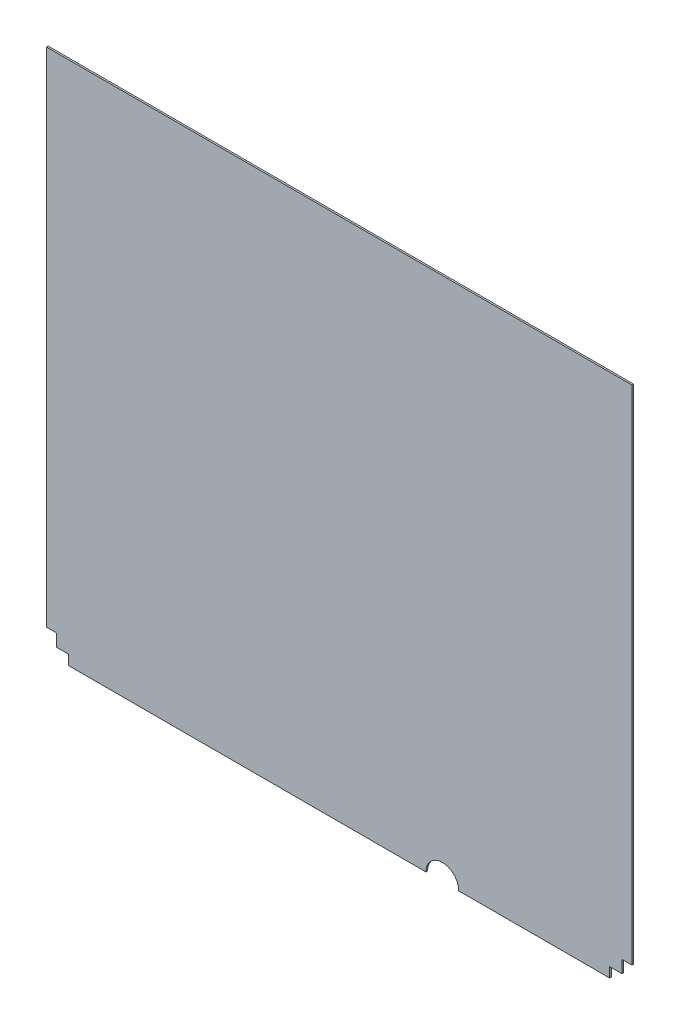
ISO-10303-21;
HEADER;
FILE_DESCRIPTION(('STEP AP214'),'2;1');
FILE_NAME('part.step','',(''),(''),'','','');
FILE_SCHEMA(('AUTOMOTIVE_DESIGN { 1 0 10303 214 1 1 1 1 }'));
ENDSEC;
DATA;
#1=APPLICATION_CONTEXT('core data for automotive mechanical design processes');
#2=APPLICATION_PROTOCOL_DEFINITION('international standard','automotive_design',2000,#1);
#3=PRODUCT_CONTEXT('',#1,'mechanical');
#4=PRODUCT('Part','Part','',(#3));
#5=PRODUCT_RELATED_PRODUCT_CATEGORY('part','',(#4));
#6=PRODUCT_DEFINITION_FORMATION('','',#4);
#7=PRODUCT_DEFINITION_CONTEXT('part definition',#1,'design');
#8=PRODUCT_DEFINITION('design','',#6,#7);
#9=PRODUCT_DEFINITION_SHAPE('','',#8);
#10=(LENGTH_UNIT() NAMED_UNIT(*) SI_UNIT(.MILLI.,.METRE.));
#11=(NAMED_UNIT(*) PLANE_ANGLE_UNIT() SI_UNIT($,.RADIAN.));
#12=(NAMED_UNIT(*) SI_UNIT($,.STERADIAN.) SOLID_ANGLE_UNIT());
#13=UNCERTAINTY_MEASURE_WITH_UNIT(LENGTH_MEASURE(1.E-05),#10,'distance_accuracy_value','');
#14=(GEOMETRIC_REPRESENTATION_CONTEXT(3) GLOBAL_UNCERTAINTY_ASSIGNED_CONTEXT((#13)) GLOBAL_UNIT_ASSIGNED_CONTEXT((#10,
#11,#12)) REPRESENTATION_CONTEXT('',''));
#15=CARTESIAN_POINT('',(0.,0.,0.));
#16=DIRECTION('',(0.,0.,1.));
#17=DIRECTION('',(1.,0.,0.));
#18=AXIS2_PLACEMENT_3D('',#15,#16,#17);
#19=CARTESIAN_POINT('',(613.304273944376,0.,2.54));
#20=DIRECTION('',(0.,0.,-1.));
#21=DIRECTION('',(-1.,0.,0.));
#22=AXIS2_PLACEMENT_3D('',#19,#20,#21);
#23=CYLINDRICAL_SURFACE('',#22,25.4);
#24=CARTESIAN_POINT('',(613.304273944376,0.,0.));
#25=DIRECTION('',(0.,0.,1.));
#26=DIRECTION('',(1.,0.,0.));
#27=AXIS2_PLACEMENT_3D('',#24,#25,#26);
#28=CIRCLE('',#27,25.4);
#29=CARTESIAN_POINT('',(638.704273944376,0.,0.));
#30=VERTEX_POINT('',#29);
#31=CARTESIAN_POINT('',(587.904273944376,0.,0.));
#32=VERTEX_POINT('',#31);
#33=EDGE_CURVE('E182',#30,#32,#28,.T.);
#34=ORIENTED_EDGE('',*,*,#33,.F.);
#35=DIRECTION('',(0.,0.,-1.));
#36=VECTOR('',#35,1.);
#37=CARTESIAN_POINT('',(638.704273944376,0.,2.54));
#38=LINE('',#37,#36);
#39=CARTESIAN_POINT('',(638.704273944376,0.,2.54));
#40=VERTEX_POINT('',#39);
#41=EDGE_CURVE('E11',#40,#30,#38,.T.);
#42=ORIENTED_EDGE('',*,*,#41,.F.);
#43=CARTESIAN_POINT('',(613.304273944376,0.,2.54));
#44=DIRECTION('',(0.,0.,1.));
#45=DIRECTION('',(1.,0.,0.));
#46=AXIS2_PLACEMENT_3D('',#43,#44,#45);
#47=CIRCLE('',#46,25.4);
#48=CARTESIAN_POINT('',(587.904273944376,0.,2.54));
#49=VERTEX_POINT('',#48);
#50=EDGE_CURVE('E287',#40,#49,#47,.T.);
#51=ORIENTED_EDGE('',*,*,#50,.T.);
#52=DIRECTION('',(0.,0.,-1.));
#53=VECTOR('',#52,1.);
#54=CARTESIAN_POINT('',(587.904273944376,0.,2.54));
#55=LINE('',#54,#53);
#56=EDGE_CURVE('E117',#49,#32,#55,.T.);
#57=ORIENTED_EDGE('',*,*,#56,.T.);
#58=EDGE_LOOP('',(#34,#42,#51,#57));
#59=FACE_BOUND('',#58,.T.);
#60=ADVANCED_FACE('F47',(#59),#23,.F.);
#61=CARTESIAN_POINT('',(0.,0.,2.54));
#62=DIRECTION('',(0.,1.,0.));
#63=DIRECTION('',(0.,0.,1.));
#64=AXIS2_PLACEMENT_3D('',#61,#62,#63);
#65=PLANE('',#64);
#66=DIRECTION('',(1.,0.,0.));
#67=VECTOR('',#66,1.);
#68=CARTESIAN_POINT('',(0.,0.,0.));
#69=LINE('',#68,#67);
#70=CARTESIAN_POINT('',(872.45698,0.,0.));
#71=VERTEX_POINT('',#70);
#72=EDGE_CURVE('E186',#30,#71,#69,.T.);
#73=ORIENTED_EDGE('',*,*,#72,.T.);
#74=DIRECTION('',(0.,0.,-1.));
#75=VECTOR('',#74,1.);
#76=CARTESIAN_POINT('',(872.45698,0.,2.54));
#77=LINE('',#76,#75);
#78=CARTESIAN_POINT('',(872.45698,0.,2.54));
#79=VERTEX_POINT('',#78);
#80=EDGE_CURVE('E56',#79,#71,#77,.T.);
#81=ORIENTED_EDGE('',*,*,#80,.F.);
#82=DIRECTION('',(1.,0.,0.));
#83=VECTOR('',#82,1.);
#84=CARTESIAN_POINT('',(0.,0.,2.54));
#85=LINE('',#84,#83);
#86=EDGE_CURVE('E179',#40,#79,#85,.T.);
#87=ORIENTED_EDGE('',*,*,#86,.F.);
#88=ORIENTED_EDGE('',*,*,#41,.T.);
#89=EDGE_LOOP('',(#73,#81,#87,#88));
#90=FACE_BOUND('',#89,.T.);
#91=ADVANCED_FACE('F269',(#90),#65,.F.);
#92=CARTESIAN_POINT('',(872.45698,0.,2.54));
#93=DIRECTION('',(1.,0.,0.));
#94=DIRECTION('',(0.,0.,-1.));
#95=AXIS2_PLACEMENT_3D('',#92,#93,#94);
#96=PLANE('',#95);
#97=DIRECTION('',(0.,-1.,0.));
#98=VECTOR('',#97,1.);
#99=CARTESIAN_POINT('',(872.45698,0.,0.));
#100=LINE('',#99,#98);
#101=CARTESIAN_POINT('',(872.45698,15.24,0.));
#102=VERTEX_POINT('',#101);
#103=EDGE_CURVE('E190',#102,#71,#100,.T.);
#104=ORIENTED_EDGE('',*,*,#103,.F.);
#105=DIRECTION('',(0.,0.,-1.));
#106=VECTOR('',#105,1.);
#107=CARTESIAN_POINT('',(872.45698,15.24,2.54));
#108=LINE('',#107,#106);
#109=CARTESIAN_POINT('',(872.45698,15.24,2.54));
#110=VERTEX_POINT('',#109);
#111=EDGE_CURVE('E257',#110,#102,#108,.T.);
#112=ORIENTED_EDGE('',*,*,#111,.F.);
#113=DIRECTION('',(0.,-1.,0.));
#114=VECTOR('',#113,1.);
#115=CARTESIAN_POINT('',(872.45698,0.,2.54));
#116=LINE('',#115,#114);
#117=EDGE_CURVE('E266',#110,#79,#116,.T.);
#118=ORIENTED_EDGE('',*,*,#117,.T.);
#119=ORIENTED_EDGE('',*,*,#80,.T.);
#120=EDGE_LOOP('',(#104,#112,#118,#119));
#121=FACE_BOUND('',#120,.T.);
#122=ADVANCED_FACE('F264',(#121),#96,.T.);
#123=CARTESIAN_POINT('',(0.,15.2399999999999,2.54));
#124=DIRECTION('',(0.,-1.,0.));
#125=DIRECTION('',(1.,0.,0.));
#126=AXIS2_PLACEMENT_3D('',#123,#124,#125);
#127=PLANE('',#126);
#128=DIRECTION('',(-1.,0.,0.));
#129=VECTOR('',#128,1.);
#130=CARTESIAN_POINT('',(0.,15.2399999999999,0.));
#131=LINE('',#130,#129);
#132=CARTESIAN_POINT('',(891.76098,15.24,0.));
#133=VERTEX_POINT('',#132);
#134=EDGE_CURVE('E195',#133,#102,#131,.T.);
#135=ORIENTED_EDGE('',*,*,#134,.F.);
#136=DIRECTION('',(0.,0.,-1.));
#137=VECTOR('',#136,1.);
#138=CARTESIAN_POINT('',(891.76098,15.24,2.54));
#139=LINE('',#138,#137);
#140=CARTESIAN_POINT('',(891.76098,15.24,2.54));
#141=VERTEX_POINT('',#140);
#142=EDGE_CURVE('E254',#141,#133,#139,.T.);
#143=ORIENTED_EDGE('',*,*,#142,.F.);
#144=DIRECTION('',(-1.,0.,0.));
#145=VECTOR('',#144,1.);
#146=CARTESIAN_POINT('',(0.,15.2399999999999,2.54));
#147=LINE('',#146,#145);
#148=EDGE_CURVE('E278',#141,#110,#147,.T.);
#149=ORIENTED_EDGE('',*,*,#148,.T.);
#150=ORIENTED_EDGE('',*,*,#111,.T.);
#151=EDGE_LOOP('',(#135,#143,#149,#150));
#152=FACE_BOUND('',#151,.T.);
#153=ADVANCED_FACE('F275',(#152),#127,.T.);
#154=CARTESIAN_POINT('',(891.76098,0.,2.54));
#155=DIRECTION('',(1.,0.,0.));
#156=DIRECTION('',(0.,0.,-1.));
#157=AXIS2_PLACEMENT_3D('',#154,#155,#156);
#158=PLANE('',#157);
#159=DIRECTION('',(0.,-1.,0.));
#160=VECTOR('',#159,1.);
#161=CARTESIAN_POINT('',(891.76098,0.,0.));
#162=LINE('',#161,#160);
#163=CARTESIAN_POINT('',(891.76098,34.544,0.));
#164=VERTEX_POINT('',#163);
#165=EDGE_CURVE('E199',#164,#133,#162,.T.);
#166=ORIENTED_EDGE('',*,*,#165,.F.);
#167=DIRECTION('',(0.,0.,-1.));
#168=VECTOR('',#167,1.);
#169=CARTESIAN_POINT('',(891.76098,34.544,2.54));
#170=LINE('',#169,#168);
#171=CARTESIAN_POINT('',(891.76098,34.544,2.54));
#172=VERTEX_POINT('',#171);
#173=EDGE_CURVE('E251',#172,#164,#170,.T.);
#174=ORIENTED_EDGE('',*,*,#173,.F.);
#175=DIRECTION('',(0.,-1.,0.));
#176=VECTOR('',#175,1.);
#177=CARTESIAN_POINT('',(891.76098,0.,2.54));
#178=LINE('',#177,#176);
#179=EDGE_CURVE('E285',#172,#141,#178,.T.);
#180=ORIENTED_EDGE('',*,*,#179,.T.);
#181=ORIENTED_EDGE('',*,*,#142,.T.);
#182=EDGE_LOOP('',(#166,#174,#180,#181));
#183=FACE_BOUND('',#182,.T.);
#184=ADVANCED_FACE('F365',(#183),#158,.T.);
#185=CARTESIAN_POINT('',(0.,34.5439999999996,2.54));
#186=DIRECTION('',(0.,-1.,0.));
#187=DIRECTION('',(1.,0.,0.));
#188=AXIS2_PLACEMENT_3D('',#185,#186,#187);
#189=PLANE('',#188);
#190=DIRECTION('',(-1.,0.,0.));
#191=VECTOR('',#190,1.);
#192=CARTESIAN_POINT('',(0.,34.5439999999996,0.));
#193=LINE('',#192,#191);
#194=CARTESIAN_POINT('',(907.00098,34.544,0.));
#195=VERTEX_POINT('',#194);
#196=EDGE_CURVE('E203',#195,#164,#193,.T.);
#197=ORIENTED_EDGE('',*,*,#196,.F.);
#198=DIRECTION('',(0.,0.,-1.));
#199=VECTOR('',#198,1.);
#200=CARTESIAN_POINT('',(907.00098,34.544,2.54));
#201=LINE('',#200,#199);
#202=CARTESIAN_POINT('',(907.00098,34.544,2.54));
#203=VERTEX_POINT('',#202);
#204=EDGE_CURVE('E248',#203,#195,#201,.T.);
#205=ORIENTED_EDGE('',*,*,#204,.F.);
#206=DIRECTION('',(-1.,0.,0.));
#207=VECTOR('',#206,1.);
#208=CARTESIAN_POINT('',(0.,34.5439999999996,2.54));
#209=LINE('',#208,#207);
#210=EDGE_CURVE('E292',#203,#172,#209,.T.);
#211=ORIENTED_EDGE('',*,*,#210,.T.);
#212=ORIENTED_EDGE('',*,*,#173,.T.);
#213=EDGE_LOOP('',(#197,#205,#211,#212));
#214=FACE_BOUND('',#213,.T.);
#215=ADVANCED_FACE('F361',(#214),#189,.T.);
#216=CARTESIAN_POINT('',(907.00098,0.,2.54));
#217=DIRECTION('',(-1.,0.,0.));
#218=DIRECTION('',(0.,0.,1.));
#219=AXIS2_PLACEMENT_3D('',#216,#217,#218);
#220=PLANE('',#219);
#221=DIRECTION('',(0.,1.,0.));
#222=VECTOR('',#221,1.);
#223=CARTESIAN_POINT('',(907.00098,0.,0.));
#224=LINE('',#223,#222);
#225=CARTESIAN_POINT('',(907.00098,812.8,0.));
#226=VERTEX_POINT('',#225);
#227=EDGE_CURVE('E207',#195,#226,#224,.T.);
#228=ORIENTED_EDGE('',*,*,#227,.T.);
#229=DIRECTION('',(0.,0.,-1.));
#230=VECTOR('',#229,1.);
#231=CARTESIAN_POINT('',(907.00098,812.8,2.54));
#232=LINE('',#231,#230);
#233=CARTESIAN_POINT('',(907.00098,812.8,2.54));
#234=VERTEX_POINT('',#233);
#235=EDGE_CURVE('E245',#234,#226,#232,.T.);
#236=ORIENTED_EDGE('',*,*,#235,.F.);
#237=DIRECTION('',(0.,1.,0.));
#238=VECTOR('',#237,1.);
#239=CARTESIAN_POINT('',(907.00098,0.,2.54));
#240=LINE('',#239,#238);
#241=EDGE_CURVE('E296',#203,#234,#240,.T.);
#242=ORIENTED_EDGE('',*,*,#241,.F.);
#243=ORIENTED_EDGE('',*,*,#204,.T.);
#244=EDGE_LOOP('',(#228,#236,#242,#243));
#245=FACE_BOUND('',#244,.T.);
#246=ADVANCED_FACE('F357',(#245),#220,.F.);
#247=CARTESIAN_POINT('',(0.,812.8,2.54));
#248=DIRECTION('',(0.,1.,0.));
#249=DIRECTION('',(0.,0.,1.));
#250=AXIS2_PLACEMENT_3D('',#247,#248,#249);
#251=PLANE('',#250);
#252=DIRECTION('',(1.,0.,0.));
#253=VECTOR('',#252,1.);
#254=CARTESIAN_POINT('',(0.,812.8,0.));
#255=LINE('',#254,#253);
#256=CARTESIAN_POINT('',(0.,812.8,0.));
#257=VERTEX_POINT('',#256);
#258=EDGE_CURVE('E211',#257,#226,#255,.T.);
#259=ORIENTED_EDGE('',*,*,#258,.F.);
#260=DIRECTION('',(0.,0.,-1.));
#261=VECTOR('',#260,1.);
#262=CARTESIAN_POINT('',(0.,812.8,2.54));
#263=LINE('',#262,#261);
#264=CARTESIAN_POINT('',(0.,812.8,2.54));
#265=VERTEX_POINT('',#264);
#266=EDGE_CURVE('E242',#265,#257,#263,.T.);
#267=ORIENTED_EDGE('',*,*,#266,.F.);
#268=DIRECTION('',(1.,0.,0.));
#269=VECTOR('',#268,1.);
#270=CARTESIAN_POINT('',(0.,812.8,2.54));
#271=LINE('',#270,#269);
#272=EDGE_CURVE('E299',#265,#234,#271,.T.);
#273=ORIENTED_EDGE('',*,*,#272,.T.);
#274=ORIENTED_EDGE('',*,*,#235,.T.);
#275=EDGE_LOOP('',(#259,#267,#273,#274));
#276=FACE_BOUND('',#275,.T.);
#277=ADVANCED_FACE('F353',(#276),#251,.T.);
#278=CARTESIAN_POINT('',(0.,0.,2.54));
#279=DIRECTION('',(-1.,0.,0.));
#280=DIRECTION('',(0.,0.,1.));
#281=AXIS2_PLACEMENT_3D('',#278,#279,#280);
#282=PLANE('',#281);
#283=DIRECTION('',(0.,1.,0.));
#284=VECTOR('',#283,1.);
#285=CARTESIAN_POINT('',(0.,0.,0.));
#286=LINE('',#285,#284);
#287=CARTESIAN_POINT('',(0.,34.544,0.));
#288=VERTEX_POINT('',#287);
#289=EDGE_CURVE('E215',#288,#257,#286,.T.);
#290=ORIENTED_EDGE('',*,*,#289,.F.);
#291=DIRECTION('',(0.,0.,-1.));
#292=VECTOR('',#291,1.);
#293=CARTESIAN_POINT('',(0.,34.544,2.54));
#294=LINE('',#293,#292);
#295=CARTESIAN_POINT('',(0.,34.544,2.54));
#296=VERTEX_POINT('',#295);
#297=EDGE_CURVE('E239',#296,#288,#294,.T.);
#298=ORIENTED_EDGE('',*,*,#297,.F.);
#299=DIRECTION('',(0.,1.,0.));
#300=VECTOR('',#299,1.);
#301=CARTESIAN_POINT('',(0.,0.,2.54));
#302=LINE('',#301,#300);
#303=EDGE_CURVE('E303',#296,#265,#302,.T.);
#304=ORIENTED_EDGE('',*,*,#303,.T.);
#305=ORIENTED_EDGE('',*,*,#266,.T.);
#306=EDGE_LOOP('',(#290,#298,#304,#305));
#307=FACE_BOUND('',#306,.T.);
#308=ADVANCED_FACE('F350',(#307),#282,.T.);
#309=CARTESIAN_POINT('',(0.,34.544,2.54));
#310=DIRECTION('',(0.,1.,0.));
#311=DIRECTION('',(0.,0.,1.));
#312=AXIS2_PLACEMENT_3D('',#309,#310,#311);
#313=PLANE('',#312);
#314=DIRECTION('',(1.,0.,0.));
#315=VECTOR('',#314,1.);
#316=CARTESIAN_POINT('',(0.,34.544,0.));
#317=LINE('',#316,#315);
#318=CARTESIAN_POINT('',(15.24,34.544,0.));
#319=VERTEX_POINT('',#318);
#320=EDGE_CURVE('E219',#288,#319,#317,.T.);
#321=ORIENTED_EDGE('',*,*,#320,.T.);
#322=DIRECTION('',(0.,0.,-1.));
#323=VECTOR('',#322,1.);
#324=CARTESIAN_POINT('',(15.24,34.544,2.54));
#325=LINE('',#324,#323);
#326=CARTESIAN_POINT('',(15.24,34.544,2.54));
#327=VERTEX_POINT('',#326);
#328=EDGE_CURVE('E235',#327,#319,#325,.T.);
#329=ORIENTED_EDGE('',*,*,#328,.F.);
#330=DIRECTION('',(1.,0.,0.));
#331=VECTOR('',#330,1.);
#332=CARTESIAN_POINT('',(0.,34.544,2.54));
#333=LINE('',#332,#331);
#334=EDGE_CURVE('E307',#296,#327,#333,.T.);
#335=ORIENTED_EDGE('',*,*,#334,.F.);
#336=ORIENTED_EDGE('',*,*,#297,.T.);
#337=EDGE_LOOP('',(#321,#329,#335,#336));
#338=FACE_BOUND('',#337,.T.);
#339=ADVANCED_FACE('F315',(#338),#313,.F.);
#340=CARTESIAN_POINT('',(15.24,0.,2.54));
#341=DIRECTION('',(1.,0.,0.));
#342=DIRECTION('',(0.,1.,0.));
#343=AXIS2_PLACEMENT_3D('',#340,#341,#342);
#344=PLANE('',#343);
#345=DIRECTION('',(0.,-1.,0.));
#346=VECTOR('',#345,1.);
#347=CARTESIAN_POINT('',(15.24,0.,0.));
#348=LINE('',#347,#346);
#349=CARTESIAN_POINT('',(15.24,15.24,0.));
#350=VERTEX_POINT('',#349);
#351=EDGE_CURVE('E222',#319,#350,#348,.T.);
#352=ORIENTED_EDGE('',*,*,#351,.T.);
#353=DIRECTION('',(0.,0.,-1.));
#354=VECTOR('',#353,1.);
#355=CARTESIAN_POINT('',(15.24,15.24,2.54));
#356=LINE('',#355,#354);
#357=CARTESIAN_POINT('',(15.24,15.24,2.54));
#358=VERTEX_POINT('',#357);
#359=EDGE_CURVE('E171',#358,#350,#356,.T.);
#360=ORIENTED_EDGE('',*,*,#359,.F.);
#361=DIRECTION('',(0.,-1.,0.));
#362=VECTOR('',#361,1.);
#363=CARTESIAN_POINT('',(15.24,0.,2.54));
#364=LINE('',#363,#362);
#365=EDGE_CURVE('E160',#327,#358,#364,.T.);
#366=ORIENTED_EDGE('',*,*,#365,.F.);
#367=ORIENTED_EDGE('',*,*,#328,.T.);
#368=EDGE_LOOP('',(#352,#360,#366,#367));
#369=FACE_BOUND('',#368,.T.);
#370=ADVANCED_FACE('F319',(#369),#344,.F.);
#371=CARTESIAN_POINT('',(0.,15.24,2.54));
#372=DIRECTION('',(0.,1.,0.));
#373=DIRECTION('',(0.,0.,1.));
#374=AXIS2_PLACEMENT_3D('',#371,#372,#373);
#375=PLANE('',#374);
#376=DIRECTION('',(1.,0.,0.));
#377=VECTOR('',#376,1.);
#378=CARTESIAN_POINT('',(0.,15.24,0.));
#379=LINE('',#378,#377);
#380=CARTESIAN_POINT('',(34.544,15.24,0.));
#381=VERTEX_POINT('',#380);
#382=EDGE_CURVE('E169',#350,#381,#379,.T.);
#383=ORIENTED_EDGE('',*,*,#382,.T.);
#384=DIRECTION('',(0.,0.,-1.));
#385=VECTOR('',#384,1.);
#386=CARTESIAN_POINT('',(34.544,15.24,2.54));
#387=LINE('',#386,#385);
#388=CARTESIAN_POINT('',(34.544,15.24,2.54));
#389=VERTEX_POINT('',#388);
#390=EDGE_CURVE('E166',#389,#381,#387,.T.);
#391=ORIENTED_EDGE('',*,*,#390,.F.);
#392=DIRECTION('',(1.,0.,0.));
#393=VECTOR('',#392,1.);
#394=CARTESIAN_POINT('',(0.,15.24,2.54));
#395=LINE('',#394,#393);
#396=EDGE_CURVE('E154',#358,#389,#395,.T.);
#397=ORIENTED_EDGE('',*,*,#396,.F.);
#398=ORIENTED_EDGE('',*,*,#359,.T.);
#399=EDGE_LOOP('',(#383,#391,#397,#398));
#400=FACE_BOUND('',#399,.T.);
#401=ADVANCED_FACE('F167',(#400),#375,.F.);
#402=CARTESIAN_POINT('',(34.544,0.,2.54));
#403=DIRECTION('',(1.,0.,0.));
#404=DIRECTION('',(0.,0.,-1.));
#405=AXIS2_PLACEMENT_3D('',#402,#403,#404);
#406=PLANE('',#405);
#407=DIRECTION('',(0.,-1.,0.));
#408=VECTOR('',#407,1.);
#409=CARTESIAN_POINT('',(34.544,0.,0.));
#410=LINE('',#409,#408);
#411=CARTESIAN_POINT('',(34.544,0.,0.));
#412=VERTEX_POINT('',#411);
#413=EDGE_CURVE('E110',#381,#412,#410,.T.);
#414=ORIENTED_EDGE('',*,*,#413,.T.);
#415=DIRECTION('',(0.,0.,-1.));
#416=VECTOR('',#415,1.);
#417=CARTESIAN_POINT('',(34.544,0.,2.54));
#418=LINE('',#417,#416);
#419=CARTESIAN_POINT('',(34.544,0.,2.54));
#420=VERTEX_POINT('',#419);
#421=EDGE_CURVE('E172',#420,#412,#418,.T.);
#422=ORIENTED_EDGE('',*,*,#421,.F.);
#423=DIRECTION('',(0.,-1.,0.));
#424=VECTOR('',#423,1.);
#425=CARTESIAN_POINT('',(34.544,0.,2.54));
#426=LINE('',#425,#424);
#427=EDGE_CURVE('E158',#389,#420,#426,.T.);
#428=ORIENTED_EDGE('',*,*,#427,.F.);
#429=ORIENTED_EDGE('',*,*,#390,.T.);
#430=EDGE_LOOP('',(#414,#422,#428,#429));
#431=FACE_BOUND('',#430,.T.);
#432=ADVANCED_FACE('F174',(#431),#406,.F.);
#433=EDGE_CURVE('E191',#412,#32,#69,.T.);
#434=ORIENTED_EDGE('',*,*,#433,.T.);
#435=ORIENTED_EDGE('',*,*,#56,.F.);
#436=EDGE_CURVE('E64',#420,#49,#85,.T.);
#437=ORIENTED_EDGE('',*,*,#436,.F.);
#438=ORIENTED_EDGE('',*,*,#421,.T.);
#439=EDGE_LOOP('',(#434,#435,#437,#438));
#440=FACE_BOUND('',#439,.T.);
#441=ADVANCED_FACE('F329',(#440),#65,.F.);
#442=CARTESIAN_POINT('',(0.,0.,2.54));
#443=DIRECTION('',(0.,0.,1.));
#444=DIRECTION('',(1.,0.,0.));
#445=AXIS2_PLACEMENT_3D('',#442,#443,#444);
#446=PLANE('',#445);
#447=ORIENTED_EDGE('',*,*,#50,.F.);
#448=ORIENTED_EDGE('',*,*,#86,.T.);
#449=ORIENTED_EDGE('',*,*,#117,.F.);
#450=ORIENTED_EDGE('',*,*,#148,.F.);
#451=ORIENTED_EDGE('',*,*,#179,.F.);
#452=ORIENTED_EDGE('',*,*,#210,.F.);
#453=ORIENTED_EDGE('',*,*,#241,.T.);
#454=ORIENTED_EDGE('',*,*,#272,.F.);
#455=ORIENTED_EDGE('',*,*,#303,.F.);
#456=ORIENTED_EDGE('',*,*,#334,.T.);
#457=ORIENTED_EDGE('',*,*,#365,.T.);
#458=ORIENTED_EDGE('',*,*,#396,.T.);
#459=ORIENTED_EDGE('',*,*,#427,.T.);
#460=ORIENTED_EDGE('',*,*,#436,.T.);
#461=EDGE_LOOP('',(#447,#448,#449,#450,#451,#452,#453,#454,#455,#456,#457,#458,#459,#460));
#462=FACE_BOUND('',#461,.T.);
#463=ADVANCED_FACE('F156',(#462),#446,.T.);
#464=CARTESIAN_POINT('',(0.,0.,0.));
#465=DIRECTION('',(0.,0.,1.));
#466=DIRECTION('',(1.,0.,0.));
#467=AXIS2_PLACEMENT_3D('',#464,#465,#466);
#468=PLANE('',#467);
#469=ORIENTED_EDGE('',*,*,#33,.T.);
#470=ORIENTED_EDGE('',*,*,#433,.F.);
#471=ORIENTED_EDGE('',*,*,#413,.F.);
#472=ORIENTED_EDGE('',*,*,#382,.F.);
#473=ORIENTED_EDGE('',*,*,#351,.F.);
#474=ORIENTED_EDGE('',*,*,#320,.F.);
#475=ORIENTED_EDGE('',*,*,#289,.T.);
#476=ORIENTED_EDGE('',*,*,#258,.T.);
#477=ORIENTED_EDGE('',*,*,#227,.F.);
#478=ORIENTED_EDGE('',*,*,#196,.T.);
#479=ORIENTED_EDGE('',*,*,#165,.T.);
#480=ORIENTED_EDGE('',*,*,#134,.T.);
#481=ORIENTED_EDGE('',*,*,#103,.T.);
#482=ORIENTED_EDGE('',*,*,#72,.F.);
#483=EDGE_LOOP('',(#469,#470,#471,#472,#473,#474,#475,#476,#477,#478,#479,#480,#481,#482));
#484=FACE_BOUND('',#483,.T.);
#485=ADVANCED_FACE('F271',(#484),#468,.F.);
#486=CLOSED_SHELL('',(#60,#91,#122,#153,#184,#215,#246,#277,#308,#339,#370,#401,#432,#441,#463,#485));
#487=MANIFOLD_SOLID_BREP('B2',#486);
#488=ADVANCED_BREP_SHAPE_REPRESENTATION('',(#18,#487),#14);
#489=SHAPE_DEFINITION_REPRESENTATION(#9,#488);
ENDSEC;
END-ISO-10303-21;
